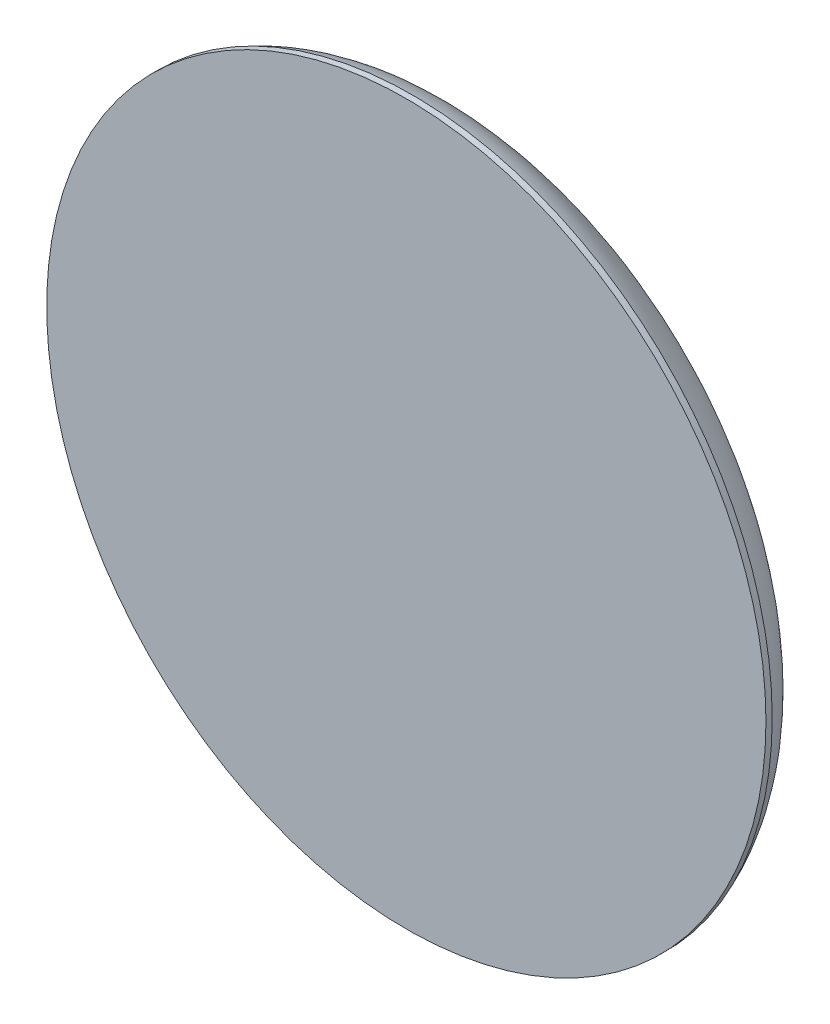
ISO-10303-21;
HEADER;
FILE_DESCRIPTION(('STEP AP214'),'2;1');
FILE_NAME('part.step','',(''),(''),'','','');
FILE_SCHEMA(('AUTOMOTIVE_DESIGN { 1 0 10303 214 1 1 1 1 }'));
ENDSEC;
DATA;
#1=APPLICATION_CONTEXT('core data for automotive mechanical design processes');
#2=APPLICATION_PROTOCOL_DEFINITION('international standard','automotive_design',2000,#1);
#3=PRODUCT_CONTEXT('',#1,'mechanical');
#4=PRODUCT('Part','Part','',(#3));
#5=PRODUCT_RELATED_PRODUCT_CATEGORY('part','',(#4));
#6=PRODUCT_DEFINITION_FORMATION('','',#4);
#7=PRODUCT_DEFINITION_CONTEXT('part definition',#1,'design');
#8=PRODUCT_DEFINITION('design','',#6,#7);
#9=PRODUCT_DEFINITION_SHAPE('','',#8);
#10=(LENGTH_UNIT() NAMED_UNIT(*) SI_UNIT(.MILLI.,.METRE.));
#11=(NAMED_UNIT(*) PLANE_ANGLE_UNIT() SI_UNIT($,.RADIAN.));
#12=(NAMED_UNIT(*) SI_UNIT($,.STERADIAN.) SOLID_ANGLE_UNIT());
#13=UNCERTAINTY_MEASURE_WITH_UNIT(LENGTH_MEASURE(1.E-05),#10,'distance_accuracy_value','');
#14=(GEOMETRIC_REPRESENTATION_CONTEXT(3) GLOBAL_UNCERTAINTY_ASSIGNED_CONTEXT((#13)) GLOBAL_UNIT_ASSIGNED_CONTEXT((#10,
#11,#12)) REPRESENTATION_CONTEXT('',''));
#15=CARTESIAN_POINT('',(0.,0.,0.));
#16=DIRECTION('',(0.,0.,1.));
#17=DIRECTION('',(1.,0.,0.));
#18=AXIS2_PLACEMENT_3D('',#15,#16,#17);
#19=CARTESIAN_POINT('',(-38.1,0.,-63.5));
#20=CARTESIAN_POINT('',(-37.9344347195585,0.,3.98507217389863));
#21=CARTESIAN_POINT('',(-132.680452173172,0.,-52.0319505489475));
#22=CARTESIAN_POINT('',(-152.4,0.,0.));
#23=B_SPLINE_CURVE_WITH_KNOTS('',3,(#19,#20,#21,#22),.UNSPECIFIED.,.F.,.F.,(4,4),(0.,1.),.UNSPECIFIED.);
#24=CARTESIAN_POINT('',(0.,0.,0.));
#25=DIRECTION('',(0.,0.,1.));
#26=AXIS1_PLACEMENT('',#24,#25);
#27=SURFACE_OF_REVOLUTION('',#23,#26);
#28=CARTESIAN_POINT('',(0.,0.,0.));
#29=DIRECTION('',(0.,0.,1.));
#30=DIRECTION('',(1.,0.,0.));
#31=AXIS2_PLACEMENT_3D('',#28,#29,#30);
#32=CIRCLE('',#31,152.4);
#33=CARTESIAN_POINT('',(152.4,0.,0.));
#34=VERTEX_POINT('',#33);
#35=EDGE_CURVE('E12',#34,#34,#32,.T.);
#36=ORIENTED_EDGE('',*,*,#35,.F.);
#37=EDGE_LOOP('',(#36));
#38=FACE_BOUND('',#37,.T.);
#39=CARTESIAN_POINT('',(0.,0.,-63.5));
#40=DIRECTION('',(0.,0.,1.));
#41=DIRECTION('',(1.,0.,0.));
#42=AXIS2_PLACEMENT_3D('',#39,#40,#41);
#43=CIRCLE('',#42,38.1);
#44=CARTESIAN_POINT('',(38.1,0.,-63.5));
#45=VERTEX_POINT('',#44);
#46=EDGE_CURVE('E63',#45,#45,#43,.T.);
#47=ORIENTED_EDGE('',*,*,#46,.T.);
#48=EDGE_LOOP('',(#47));
#49=FACE_BOUND('',#48,.T.);
#50=ADVANCED_FACE('F52',(#38,#49),#27,.T.);
#51=CARTESIAN_POINT('',(0.,0.,0.));
#52=DIRECTION('',(0.,0.,1.));
#53=DIRECTION('',(1.,0.,0.));
#54=AXIS2_PLACEMENT_3D('',#51,#52,#53);
#55=CYLINDRICAL_SURFACE('',#54,152.4);
#56=CARTESIAN_POINT('',(0.,0.,2.65526760897323));
#57=DIRECTION('',(0.,0.,1.));
#58=DIRECTION('',(1.,0.,0.));
#59=AXIS2_PLACEMENT_3D('',#56,#57,#58);
#60=CIRCLE('',#59,152.4);
#61=CARTESIAN_POINT('',(152.4,0.,2.65526760897326));
#62=VERTEX_POINT('',#61);
#63=EDGE_CURVE('E58',#62,#62,#60,.T.);
#64=ORIENTED_EDGE('',*,*,#63,.F.);
#65=EDGE_LOOP('',(#64));
#66=FACE_BOUND('',#65,.T.);
#67=ORIENTED_EDGE('',*,*,#35,.T.);
#68=EDGE_LOOP('',(#67));
#69=FACE_BOUND('',#68,.T.);
#70=ADVANCED_FACE('F82',(#66,#69),#55,.T.);
#71=CARTESIAN_POINT('',(0.,0.,2.65526760897321));
#72=DIRECTION('',(0.,0.,-1.));
#73=DIRECTION('',(-1.,0.,0.));
#74=AXIS2_PLACEMENT_3D('',#71,#72,#73);
#75=PLANE('',#74);
#76=ORIENTED_EDGE('',*,*,#63,.T.);
#77=EDGE_LOOP('',(#76));
#78=FACE_BOUND('',#77,.T.);
#79=ADVANCED_FACE('F79',(#78),#75,.F.);
#80=CARTESIAN_POINT('',(-38.1,0.,-63.5));
#81=DIRECTION('',(0.,0.,1.));
#82=DIRECTION('',(1.,0.,0.));
#83=AXIS2_PLACEMENT_3D('',#80,#81,#82);
#84=PLANE('',#83);
#85=ORIENTED_EDGE('',*,*,#46,.F.);
#86=EDGE_LOOP('',(#85));
#87=FACE_BOUND('',#86,.T.);
#88=ADVANCED_FACE('F77',(#87),#84,.F.);
#89=CLOSED_SHELL('',(#50,#70,#79,#88));
#90=MANIFOLD_SOLID_BREP('B2',#89);
#91=CARTESIAN_POINT('',(0.,0.,-63.5));
#92=DIRECTION('',(0.,0.,1.));
#93=DIRECTION('',(1.,0.,0.));
#94=AXIS2_PLACEMENT_3D('',#91,#92,#93);
#95=CONICAL_SURFACE('',#94,38.1,1.06369782240256);
#96=CARTESIAN_POINT('',(0.,0.,0.));
#97=DIRECTION('',(0.,0.,1.));
#98=DIRECTION('',(1.,0.,0.));
#99=AXIS2_PLACEMENT_3D('',#96,#97,#98);
#100=CIRCLE('',#99,152.4);
#101=CARTESIAN_POINT('',(152.4,0.,0.));
#102=VERTEX_POINT('',#101);
#103=EDGE_CURVE('E130',#102,#102,#100,.T.);
#104=ORIENTED_EDGE('',*,*,#103,.F.);
#105=EDGE_LOOP('',(#104));
#106=FACE_BOUND('',#105,.T.);
#107=CARTESIAN_POINT('',(0.,0.,-25.1954573608139));
#108=DIRECTION('',(0.,0.,1.));
#109=DIRECTION('',(1.,0.,0.));
#110=AXIS2_PLACEMENT_3D('',#107,#108,#109);
#111=CIRCLE('',#110,107.048176750535);
#112=CARTESIAN_POINT('',(107.048176750535,0.,-25.1954573608139));
#113=VERTEX_POINT('',#112);
#114=EDGE_CURVE('E55',#113,#113,#111,.F.);
#115=ORIENTED_EDGE('',*,*,#114,.F.);
#116=EDGE_LOOP('',(#115));
#117=FACE_BOUND('',#116,.T.);
#118=ADVANCED_FACE('F116',(#106,#117),#95,.T.);
#119=CARTESIAN_POINT('',(0.,0.,0.));
#120=DIRECTION('',(0.,0.,1.));
#121=DIRECTION('',(1.,0.,0.));
#122=AXIS2_PLACEMENT_3D('',#119,#120,#121);
#123=PLANE('',#122);
#124=ORIENTED_EDGE('',*,*,#103,.T.);
#125=EDGE_LOOP('',(#124));
#126=FACE_BOUND('',#125,.T.);
#127=ADVANCED_FACE('F137',(#126),#123,.T.);
#128=CARTESIAN_POINT('',(-38.1,0.,-63.5));
#129=CARTESIAN_POINT('',(-37.9344347195585,0.,3.98507217389863));
#130=CARTESIAN_POINT('',(-132.680452173172,0.,-52.0319505489475));
#131=CARTESIAN_POINT('',(-152.4,0.,0.));
#132=B_SPLINE_CURVE_WITH_KNOTS('',3,(#128,#129,#130,#131),.UNSPECIFIED.,.F.,.F.,(4,4),(0.,1.),.UNSPECIFIED.);
#133=CARTESIAN_POINT('',(0.,0.,0.));
#134=DIRECTION('',(0.,0.,1.));
#135=AXIS1_PLACEMENT('',#133,#134);
#136=SURFACE_OF_REVOLUTION('',#132,#135);
#137=ORIENTED_EDGE('',*,*,#114,.T.);
#138=EDGE_LOOP('',(#137));
#139=FACE_BOUND('',#138,.T.);
#140=CARTESIAN_POINT('',(0.,0.,-63.5));
#141=DIRECTION('',(0.,0.,1.));
#142=DIRECTION('',(1.,0.,0.));
#143=AXIS2_PLACEMENT_3D('',#140,#141,#142);
#144=CIRCLE('',#143,38.1);
#145=CARTESIAN_POINT('',(38.1,0.,-63.5));
#146=VERTEX_POINT('',#145);
#147=EDGE_CURVE('E125',#146,#146,#144,.T.);
#148=ORIENTED_EDGE('',*,*,#147,.T.);
#149=EDGE_LOOP('',(#148));
#150=FACE_BOUND('',#149,.T.);
#151=ADVANCED_FACE('F149',(#139,#150),#136,.T.);
#152=CARTESIAN_POINT('',(0.,0.,-63.5));
#153=DIRECTION('',(0.,0.,1.));
#154=DIRECTION('',(1.,0.,0.));
#155=AXIS2_PLACEMENT_3D('',#152,#153,#154);
#156=PLANE('',#155);
#157=ORIENTED_EDGE('',*,*,#147,.F.);
#158=EDGE_LOOP('',(#157));
#159=FACE_BOUND('',#158,.T.);
#160=ADVANCED_FACE('F117',(#159),#156,.F.);
#161=CLOSED_SHELL('',(#118,#127,#151,#160));
#162=MANIFOLD_SOLID_BREP('B7',#161);
#163=ADVANCED_BREP_SHAPE_REPRESENTATION('',(#18,#90,#162),#14);
#164=SHAPE_DEFINITION_REPRESENTATION(#9,#163);
ENDSEC;
END-ISO-10303-21;
